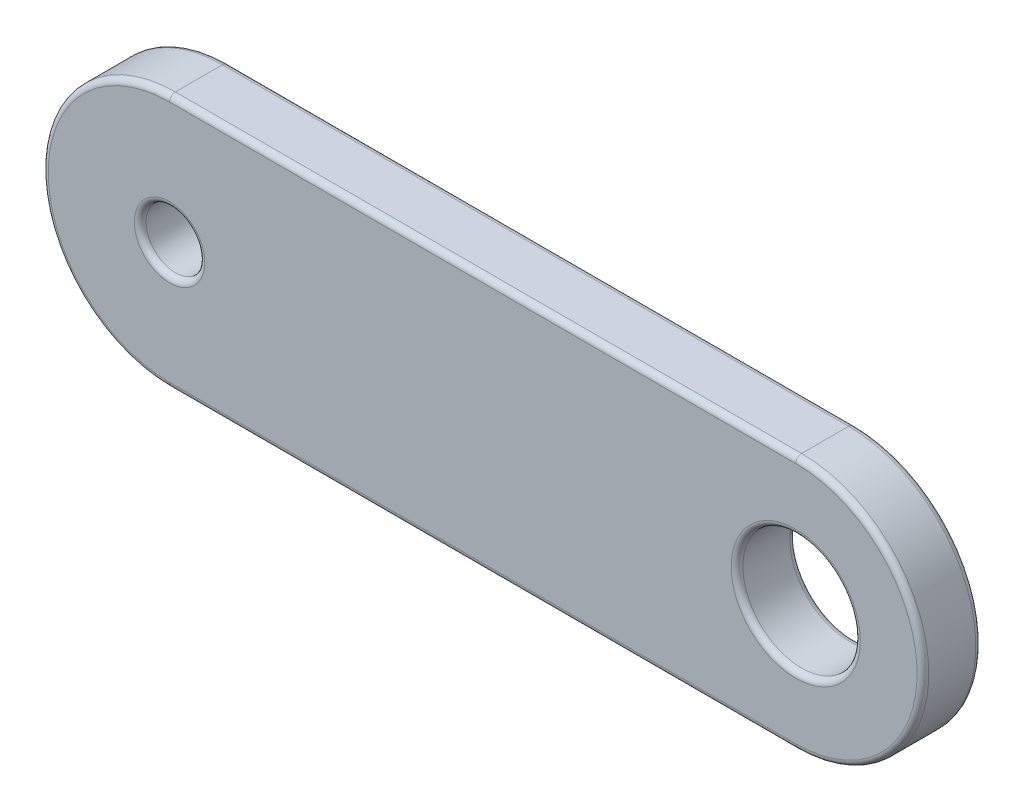
ISO-10303-21;
HEADER;
FILE_DESCRIPTION(('STEP AP214'),'2;1');
FILE_NAME('part.step','',(''),(''),'','','');
FILE_SCHEMA(('AUTOMOTIVE_DESIGN { 1 0 10303 214 1 1 1 1 }'));
ENDSEC;
DATA;
#1=APPLICATION_CONTEXT('core data for automotive mechanical design processes');
#2=APPLICATION_PROTOCOL_DEFINITION('international standard','automotive_design',2000,#1);
#3=PRODUCT_CONTEXT('',#1,'mechanical');
#4=PRODUCT('Part','Part','',(#3));
#5=PRODUCT_RELATED_PRODUCT_CATEGORY('part','',(#4));
#6=PRODUCT_DEFINITION_FORMATION('','',#4);
#7=PRODUCT_DEFINITION_CONTEXT('part definition',#1,'design');
#8=PRODUCT_DEFINITION('design','',#6,#7);
#9=PRODUCT_DEFINITION_SHAPE('','',#8);
#10=(LENGTH_UNIT() NAMED_UNIT(*) SI_UNIT(.MILLI.,.METRE.));
#11=(NAMED_UNIT(*) PLANE_ANGLE_UNIT() SI_UNIT($,.RADIAN.));
#12=(NAMED_UNIT(*) SI_UNIT($,.STERADIAN.) SOLID_ANGLE_UNIT());
#13=UNCERTAINTY_MEASURE_WITH_UNIT(LENGTH_MEASURE(1.E-05),#10,'distance_accuracy_value','');
#14=(GEOMETRIC_REPRESENTATION_CONTEXT(3) GLOBAL_UNCERTAINTY_ASSIGNED_CONTEXT((#13)) GLOBAL_UNIT_ASSIGNED_CONTEXT((#10,
#11,#12)) REPRESENTATION_CONTEXT('',''));
#15=CARTESIAN_POINT('',(0.,0.,0.));
#16=DIRECTION('',(0.,0.,1.));
#17=DIRECTION('',(1.,0.,0.));
#18=AXIS2_PLACEMENT_3D('',#15,#16,#17);
#19=CARTESIAN_POINT('',(-8.,0.,0.75));
#20=DIRECTION('',(0.,0.,1.));
#21=DIRECTION('',(1.,0.,0.));
#22=AXIS2_PLACEMENT_3D('',#19,#20,#21);
#23=PLANE('',#22);
#24=CARTESIAN_POINT('',(8.,0.,0.75));
#25=DIRECTION('',(0.,0.,1.));
#26=DIRECTION('',(1.,0.,0.));
#27=AXIS2_PLACEMENT_3D('',#24,#25,#26);
#28=CIRCLE('',#27,1.65);
#29=CARTESIAN_POINT('',(9.65,0.,0.75));
#30=VERTEX_POINT('',#29);
#31=EDGE_CURVE('E155',#30,#30,#28,.F.);
#32=ORIENTED_EDGE('',*,*,#31,.T.);
#33=EDGE_LOOP('',(#32));
#34=FACE_BOUND('',#33,.T.);
#35=CARTESIAN_POINT('',(-8.,0.,0.75));
#36=DIRECTION('',(0.,0.,1.));
#37=DIRECTION('',(1.,0.,0.));
#38=AXIS2_PLACEMENT_3D('',#35,#36,#37);
#39=CIRCLE('',#38,0.9);
#40=CARTESIAN_POINT('',(-7.1,0.,0.75));
#41=VERTEX_POINT('',#40);
#42=EDGE_CURVE('E152',#41,#41,#39,.F.);
#43=ORIENTED_EDGE('',*,*,#42,.T.);
#44=EDGE_LOOP('',(#43));
#45=FACE_BOUND('',#44,.T.);
#46=DIRECTION('',(-1.,0.,0.));
#47=VECTOR('',#46,1.);
#48=CARTESIAN_POINT('',(-8.,3.1,0.75));
#49=LINE('',#48,#47);
#50=CARTESIAN_POINT('',(8.,3.1,0.75));
#51=VERTEX_POINT('',#50);
#52=CARTESIAN_POINT('',(-8.,3.1,0.75));
#53=VERTEX_POINT('',#52);
#54=EDGE_CURVE('E143',#51,#53,#49,.T.);
#55=ORIENTED_EDGE('',*,*,#54,.T.);
#56=CARTESIAN_POINT('',(-8.,0.,0.75));
#57=DIRECTION('',(0.,0.,1.));
#58=DIRECTION('',(1.,0.,0.));
#59=AXIS2_PLACEMENT_3D('',#56,#57,#58);
#60=CIRCLE('',#59,3.1);
#61=CARTESIAN_POINT('',(-8.,-3.1,0.75));
#62=VERTEX_POINT('',#61);
#63=EDGE_CURVE('E149',#53,#62,#60,.T.);
#64=ORIENTED_EDGE('',*,*,#63,.T.);
#65=DIRECTION('',(1.,0.,0.));
#66=VECTOR('',#65,1.);
#67=CARTESIAN_POINT('',(8.,-3.1,0.75));
#68=LINE('',#67,#66);
#69=CARTESIAN_POINT('',(8.,-3.1,0.75));
#70=VERTEX_POINT('',#69);
#71=EDGE_CURVE('E147',#62,#70,#68,.T.);
#72=ORIENTED_EDGE('',*,*,#71,.T.);
#73=CARTESIAN_POINT('',(8.,0.,0.75));
#74=DIRECTION('',(0.,0.,1.));
#75=DIRECTION('',(1.,0.,0.));
#76=AXIS2_PLACEMENT_3D('',#73,#74,#75);
#77=CIRCLE('',#76,3.1);
#78=EDGE_CURVE('E145',#70,#51,#77,.T.);
#79=ORIENTED_EDGE('',*,*,#78,.T.);
#80=EDGE_LOOP('',(#55,#64,#72,#79));
#81=FACE_BOUND('',#80,.T.);
#82=ADVANCED_FACE('F33',(#34,#45,#81),#23,.T.);
#83=CARTESIAN_POINT('',(-8.,0.,-0.75));
#84=DIRECTION('',(0.,0.,1.));
#85=DIRECTION('',(1.,0.,0.));
#86=AXIS2_PLACEMENT_3D('',#83,#84,#85);
#87=PLANE('',#86);
#88=CARTESIAN_POINT('',(8.,0.,-0.75));
#89=DIRECTION('',(0.,0.,1.));
#90=DIRECTION('',(1.,0.,0.));
#91=AXIS2_PLACEMENT_3D('',#88,#89,#90);
#92=CIRCLE('',#91,1.65);
#93=CARTESIAN_POINT('',(9.65,0.,-0.75));
#94=VERTEX_POINT('',#93);
#95=EDGE_CURVE('E130',#94,#94,#92,.T.);
#96=ORIENTED_EDGE('',*,*,#95,.T.);
#97=EDGE_LOOP('',(#96));
#98=FACE_BOUND('',#97,.T.);
#99=CARTESIAN_POINT('',(-8.,0.,-0.75));
#100=DIRECTION('',(0.,0.,1.));
#101=DIRECTION('',(1.,0.,0.));
#102=AXIS2_PLACEMENT_3D('',#99,#100,#101);
#103=CIRCLE('',#102,0.9);
#104=CARTESIAN_POINT('',(-7.1,0.,-0.75));
#105=VERTEX_POINT('',#104);
#106=EDGE_CURVE('E127',#105,#105,#103,.T.);
#107=ORIENTED_EDGE('',*,*,#106,.T.);
#108=EDGE_LOOP('',(#107));
#109=FACE_BOUND('',#108,.T.);
#110=DIRECTION('',(1.,0.,0.));
#111=VECTOR('',#110,1.);
#112=CARTESIAN_POINT('',(-8.,-3.1,-0.75));
#113=LINE('',#112,#111);
#114=CARTESIAN_POINT('',(8.,-3.1,-0.75));
#115=VERTEX_POINT('',#114);
#116=CARTESIAN_POINT('',(-8.,-3.1,-0.75));
#117=VERTEX_POINT('',#116);
#118=EDGE_CURVE('E126',#115,#117,#113,.F.);
#119=ORIENTED_EDGE('',*,*,#118,.T.);
#120=CARTESIAN_POINT('',(-8.,0.,-0.75));
#121=DIRECTION('',(0.,0.,1.));
#122=DIRECTION('',(1.,0.,0.));
#123=AXIS2_PLACEMENT_3D('',#120,#121,#122);
#124=CIRCLE('',#123,3.1);
#125=CARTESIAN_POINT('',(-8.,3.1,-0.75));
#126=VERTEX_POINT('',#125);
#127=EDGE_CURVE('E105',#117,#126,#124,.F.);
#128=ORIENTED_EDGE('',*,*,#127,.T.);
#129=DIRECTION('',(-1.,0.,0.));
#130=VECTOR('',#129,1.);
#131=CARTESIAN_POINT('',(-8.,3.1,-0.75));
#132=LINE('',#131,#130);
#133=CARTESIAN_POINT('',(8.,3.1,-0.75));
#134=VERTEX_POINT('',#133);
#135=EDGE_CURVE('E115',#126,#134,#132,.F.);
#136=ORIENTED_EDGE('',*,*,#135,.T.);
#137=CARTESIAN_POINT('',(8.,0.,-0.75));
#138=DIRECTION('',(0.,0.,1.));
#139=DIRECTION('',(1.,0.,0.));
#140=AXIS2_PLACEMENT_3D('',#137,#138,#139);
#141=CIRCLE('',#140,3.1);
#142=EDGE_CURVE('E121',#134,#115,#141,.F.);
#143=ORIENTED_EDGE('',*,*,#142,.T.);
#144=EDGE_LOOP('',(#119,#128,#136,#143));
#145=FACE_BOUND('',#144,.T.);
#146=ADVANCED_FACE('F124',(#98,#109,#145),#87,.F.);
#147=CARTESIAN_POINT('',(-8.,0.,0.75));
#148=DIRECTION('',(0.,0.,-1.));
#149=DIRECTION('',(-1.,0.,0.));
#150=AXIS2_PLACEMENT_3D('',#147,#148,#149);
#151=CYLINDRICAL_SURFACE('',#150,3.25);
#152=DIRECTION('',(0.,0.,-1.));
#153=VECTOR('',#152,1.);
#154=CARTESIAN_POINT('',(-8.,3.25,0.75));
#155=LINE('',#154,#153);
#156=CARTESIAN_POINT('',(-8.,3.25,0.6));
#157=VERTEX_POINT('',#156);
#158=CARTESIAN_POINT('',(-8.,3.25,-0.6));
#159=VERTEX_POINT('',#158);
#160=EDGE_CURVE('E180',#157,#159,#155,.T.);
#161=ORIENTED_EDGE('',*,*,#160,.T.);
#162=CARTESIAN_POINT('',(-8.,0.,-0.6));
#163=DIRECTION('',(0.,0.,1.));
#164=DIRECTION('',(1.,0.,0.));
#165=AXIS2_PLACEMENT_3D('',#162,#163,#164);
#166=CIRCLE('',#165,3.25);
#167=CARTESIAN_POINT('',(-8.,-3.25,-0.6));
#168=VERTEX_POINT('',#167);
#169=EDGE_CURVE('E108',#159,#168,#166,.T.);
#170=ORIENTED_EDGE('',*,*,#169,.T.);
#171=DIRECTION('',(0.,0.,-1.));
#172=VECTOR('',#171,1.);
#173=CARTESIAN_POINT('',(-8.,-3.25,0.75));
#174=LINE('',#173,#172);
#175=CARTESIAN_POINT('',(-8.,-3.25,0.6));
#176=VERTEX_POINT('',#175);
#177=EDGE_CURVE('E122',#176,#168,#174,.T.);
#178=ORIENTED_EDGE('',*,*,#177,.F.);
#179=CARTESIAN_POINT('',(-8.,0.,0.6));
#180=DIRECTION('',(0.,0.,1.));
#181=DIRECTION('',(1.,0.,0.));
#182=AXIS2_PLACEMENT_3D('',#179,#180,#181);
#183=CIRCLE('',#182,3.25);
#184=EDGE_CURVE('E164',#176,#157,#183,.F.);
#185=ORIENTED_EDGE('',*,*,#184,.T.);
#186=EDGE_LOOP('',(#161,#170,#178,#185));
#187=FACE_BOUND('',#186,.T.);
#188=ADVANCED_FACE('F219',(#187),#151,.T.);
#189=CARTESIAN_POINT('',(-8.,-3.25,0.75));
#190=DIRECTION('',(0.,1.,0.));
#191=DIRECTION('',(-1.,0.,0.));
#192=AXIS2_PLACEMENT_3D('',#189,#190,#191);
#193=PLANE('',#192);
#194=ORIENTED_EDGE('',*,*,#177,.T.);
#195=DIRECTION('',(1.,0.,0.));
#196=VECTOR('',#195,1.);
#197=CARTESIAN_POINT('',(-8.,-3.25,-0.6));
#198=LINE('',#197,#196);
#199=CARTESIAN_POINT('',(8.,-3.25,-0.6));
#200=VERTEX_POINT('',#199);
#201=EDGE_CURVE('E170',#168,#200,#198,.T.);
#202=ORIENTED_EDGE('',*,*,#201,.T.);
#203=DIRECTION('',(0.,0.,-1.));
#204=VECTOR('',#203,1.);
#205=CARTESIAN_POINT('',(8.,-3.25,0.75));
#206=LINE('',#205,#204);
#207=CARTESIAN_POINT('',(8.,-3.25,0.6));
#208=VERTEX_POINT('',#207);
#209=EDGE_CURVE('E201',#208,#200,#206,.T.);
#210=ORIENTED_EDGE('',*,*,#209,.F.);
#211=DIRECTION('',(1.,0.,0.));
#212=VECTOR('',#211,1.);
#213=CARTESIAN_POINT('',(-8.,-3.25,0.6));
#214=LINE('',#213,#212);
#215=EDGE_CURVE('E168',#208,#176,#214,.F.);
#216=ORIENTED_EDGE('',*,*,#215,.T.);
#217=EDGE_LOOP('',(#194,#202,#210,#216));
#218=FACE_BOUND('',#217,.T.);
#219=ADVANCED_FACE('F205',(#218),#193,.F.);
#220=CARTESIAN_POINT('',(8.,0.,0.75));
#221=DIRECTION('',(0.,0.,-1.));
#222=DIRECTION('',(-1.,0.,0.));
#223=AXIS2_PLACEMENT_3D('',#220,#221,#222);
#224=CYLINDRICAL_SURFACE('',#223,3.25);
#225=ORIENTED_EDGE('',*,*,#209,.T.);
#226=CARTESIAN_POINT('',(8.,0.,-0.6));
#227=DIRECTION('',(0.,0.,1.));
#228=DIRECTION('',(1.,0.,0.));
#229=AXIS2_PLACEMENT_3D('',#226,#227,#228);
#230=CIRCLE('',#229,3.25);
#231=CARTESIAN_POINT('',(8.,3.25,-0.6));
#232=VERTEX_POINT('',#231);
#233=EDGE_CURVE('E50',#200,#232,#230,.T.);
#234=ORIENTED_EDGE('',*,*,#233,.T.);
#235=DIRECTION('',(0.,0.,-1.));
#236=VECTOR('',#235,1.);
#237=CARTESIAN_POINT('',(8.,3.25,0.75));
#238=LINE('',#237,#236);
#239=CARTESIAN_POINT('',(8.,3.25,0.6));
#240=VERTEX_POINT('',#239);
#241=EDGE_CURVE('E202',#240,#232,#238,.T.);
#242=ORIENTED_EDGE('',*,*,#241,.F.);
#243=CARTESIAN_POINT('',(8.,0.,0.6));
#244=DIRECTION('',(0.,0.,1.));
#245=DIRECTION('',(1.,0.,0.));
#246=AXIS2_PLACEMENT_3D('',#243,#244,#245);
#247=CIRCLE('',#246,3.25);
#248=EDGE_CURVE('E172',#240,#208,#247,.F.);
#249=ORIENTED_EDGE('',*,*,#248,.T.);
#250=EDGE_LOOP('',(#225,#234,#242,#249));
#251=FACE_BOUND('',#250,.T.);
#252=ADVANCED_FACE('F200',(#251),#224,.T.);
#253=CARTESIAN_POINT('',(-8.,3.25,0.75));
#254=DIRECTION('',(0.,-1.,0.));
#255=DIRECTION('',(1.,0.,0.));
#256=AXIS2_PLACEMENT_3D('',#253,#254,#255);
#257=PLANE('',#256);
#258=ORIENTED_EDGE('',*,*,#241,.T.);
#259=DIRECTION('',(-1.,0.,0.));
#260=VECTOR('',#259,1.);
#261=CARTESIAN_POINT('',(-8.,3.25,-0.6));
#262=LINE('',#261,#260);
#263=EDGE_CURVE('E11',#232,#159,#262,.T.);
#264=ORIENTED_EDGE('',*,*,#263,.T.);
#265=ORIENTED_EDGE('',*,*,#160,.F.);
#266=DIRECTION('',(-1.,0.,0.));
#267=VECTOR('',#266,1.);
#268=CARTESIAN_POINT('',(8.,3.25,0.6));
#269=LINE('',#268,#267);
#270=EDGE_CURVE('E42',#157,#240,#269,.F.);
#271=ORIENTED_EDGE('',*,*,#270,.T.);
#272=EDGE_LOOP('',(#258,#264,#265,#271));
#273=FACE_BOUND('',#272,.T.);
#274=ADVANCED_FACE('F221',(#273),#257,.F.);
#275=CARTESIAN_POINT('',(-8.,0.,0.75));
#276=DIRECTION('',(0.,0.,-1.));
#277=DIRECTION('',(-1.,0.,0.));
#278=AXIS2_PLACEMENT_3D('',#275,#276,#277);
#279=CYLINDRICAL_SURFACE('',#278,0.75);
#280=CARTESIAN_POINT('',(-8.,0.,-0.6));
#281=DIRECTION('',(0.,0.,1.));
#282=DIRECTION('',(1.,0.,0.));
#283=AXIS2_PLACEMENT_3D('',#280,#281,#282);
#284=CIRCLE('',#283,0.75);
#285=CARTESIAN_POINT('',(-7.25,0.,-0.6));
#286=VERTEX_POINT('',#285);
#287=EDGE_CURVE('E161',#286,#286,#284,.F.);
#288=ORIENTED_EDGE('',*,*,#287,.T.);
#289=EDGE_LOOP('',(#288));
#290=FACE_BOUND('',#289,.T.);
#291=CARTESIAN_POINT('',(-8.,0.,0.6));
#292=DIRECTION('',(0.,0.,1.));
#293=DIRECTION('',(1.,0.,0.));
#294=AXIS2_PLACEMENT_3D('',#291,#292,#293);
#295=CIRCLE('',#294,0.75);
#296=CARTESIAN_POINT('',(-7.25,0.,0.6));
#297=VERTEX_POINT('',#296);
#298=EDGE_CURVE('E158',#297,#297,#295,.T.);
#299=ORIENTED_EDGE('',*,*,#298,.T.);
#300=EDGE_LOOP('',(#299));
#301=FACE_BOUND('',#300,.T.);
#302=ADVANCED_FACE('F223',(#290,#301),#279,.F.);
#303=CARTESIAN_POINT('',(8.,0.,0.75));
#304=DIRECTION('',(0.,0.,-1.));
#305=DIRECTION('',(-1.,0.,0.));
#306=AXIS2_PLACEMENT_3D('',#303,#304,#305);
#307=CYLINDRICAL_SURFACE('',#306,1.5);
#308=CARTESIAN_POINT('',(8.,0.,-0.6));
#309=DIRECTION('',(0.,0.,1.));
#310=DIRECTION('',(1.,0.,0.));
#311=AXIS2_PLACEMENT_3D('',#308,#309,#310);
#312=CIRCLE('',#311,1.5);
#313=CARTESIAN_POINT('',(9.5,0.,-0.6));
#314=VERTEX_POINT('',#313);
#315=EDGE_CURVE('E140',#314,#314,#312,.F.);
#316=ORIENTED_EDGE('',*,*,#315,.T.);
#317=EDGE_LOOP('',(#316));
#318=FACE_BOUND('',#317,.T.);
#319=CARTESIAN_POINT('',(8.,0.,0.6));
#320=DIRECTION('',(0.,0.,1.));
#321=DIRECTION('',(1.,0.,0.));
#322=AXIS2_PLACEMENT_3D('',#319,#320,#321);
#323=CIRCLE('',#322,1.5);
#324=CARTESIAN_POINT('',(9.5,0.,0.6));
#325=VERTEX_POINT('',#324);
#326=EDGE_CURVE('E137',#325,#325,#323,.T.);
#327=ORIENTED_EDGE('',*,*,#326,.T.);
#328=EDGE_LOOP('',(#327));
#329=FACE_BOUND('',#328,.T.);
#330=ADVANCED_FACE('F229',(#318,#329),#307,.F.);
#331=CARTESIAN_POINT('',(8.,0.,-0.6));
#332=DIRECTION('',(0.,0.,1.));
#333=DIRECTION('',(1.,0.,0.));
#334=AXIS2_PLACEMENT_3D('',#331,#332,#333);
#335=TOROIDAL_SURFACE('',#334,1.65,0.15);
#336=ORIENTED_EDGE('',*,*,#315,.F.);
#337=EDGE_LOOP('',(#336));
#338=FACE_BOUND('',#337,.T.);
#339=ORIENTED_EDGE('',*,*,#95,.F.);
#340=EDGE_LOOP('',(#339));
#341=FACE_BOUND('',#340,.T.);
#342=ADVANCED_FACE('F244',(#338,#341),#335,.T.);
#343=CARTESIAN_POINT('',(8.,0.,0.6));
#344=DIRECTION('',(0.,0.,1.));
#345=DIRECTION('',(1.,0.,0.));
#346=AXIS2_PLACEMENT_3D('',#343,#344,#345);
#347=TOROIDAL_SURFACE('',#346,1.65,0.15);
#348=ORIENTED_EDGE('',*,*,#31,.F.);
#349=EDGE_LOOP('',(#348));
#350=FACE_BOUND('',#349,.T.);
#351=ORIENTED_EDGE('',*,*,#326,.F.);
#352=EDGE_LOOP('',(#351));
#353=FACE_BOUND('',#352,.T.);
#354=ADVANCED_FACE('F249',(#350,#353),#347,.T.);
#355=CARTESIAN_POINT('',(-8.,0.,-0.6));
#356=DIRECTION('',(0.,0.,1.));
#357=DIRECTION('',(1.,0.,0.));
#358=AXIS2_PLACEMENT_3D('',#355,#356,#357);
#359=TOROIDAL_SURFACE('',#358,0.9,0.15);
#360=ORIENTED_EDGE('',*,*,#287,.F.);
#361=EDGE_LOOP('',(#360));
#362=FACE_BOUND('',#361,.T.);
#363=ORIENTED_EDGE('',*,*,#106,.F.);
#364=EDGE_LOOP('',(#363));
#365=FACE_BOUND('',#364,.T.);
#366=ADVANCED_FACE('F257',(#362,#365),#359,.T.);
#367=CARTESIAN_POINT('',(-8.,0.,0.6));
#368=DIRECTION('',(0.,0.,1.));
#369=DIRECTION('',(1.,0.,0.));
#370=AXIS2_PLACEMENT_3D('',#367,#368,#369);
#371=TOROIDAL_SURFACE('',#370,0.9,0.15);
#372=ORIENTED_EDGE('',*,*,#42,.F.);
#373=EDGE_LOOP('',(#372));
#374=FACE_BOUND('',#373,.T.);
#375=ORIENTED_EDGE('',*,*,#298,.F.);
#376=EDGE_LOOP('',(#375));
#377=FACE_BOUND('',#376,.T.);
#378=ADVANCED_FACE('F263',(#374,#377),#371,.T.);
#379=CARTESIAN_POINT('',(8.,0.,-0.6));
#380=DIRECTION('',(0.,0.,1.));
#381=DIRECTION('',(1.,0.,0.));
#382=AXIS2_PLACEMENT_3D('',#379,#380,#381);
#383=TOROIDAL_SURFACE('',#382,3.1,0.15);
#384=CARTESIAN_POINT('',(8.,-3.1,-0.6));
#385=DIRECTION('',(-1.,0.,0.));
#386=DIRECTION('',(0.,0.,1.));
#387=AXIS2_PLACEMENT_3D('',#384,#385,#386);
#388=CIRCLE('',#387,0.15);
#389=EDGE_CURVE('E111',#115,#200,#388,.T.);
#390=ORIENTED_EDGE('',*,*,#389,.F.);
#391=ORIENTED_EDGE('',*,*,#142,.F.);
#392=CARTESIAN_POINT('',(8.,3.1,-0.6));
#393=DIRECTION('',(-1.,0.,0.));
#394=DIRECTION('',(0.,0.,1.));
#395=AXIS2_PLACEMENT_3D('',#392,#393,#394);
#396=CIRCLE('',#395,0.15);
#397=EDGE_CURVE('E118',#232,#134,#396,.T.);
#398=ORIENTED_EDGE('',*,*,#397,.F.);
#399=ORIENTED_EDGE('',*,*,#233,.F.);
#400=EDGE_LOOP('',(#390,#391,#398,#399));
#401=FACE_BOUND('',#400,.T.);
#402=ADVANCED_FACE('F214',(#401),#383,.T.);
#403=CARTESIAN_POINT('',(-8.,3.1,-0.6));
#404=DIRECTION('',(-1.,0.,0.));
#405=DIRECTION('',(0.,-1.,0.));
#406=AXIS2_PLACEMENT_3D('',#403,#404,#405);
#407=CYLINDRICAL_SURFACE('',#406,0.15);
#408=ORIENTED_EDGE('',*,*,#397,.T.);
#409=ORIENTED_EDGE('',*,*,#135,.F.);
#410=CARTESIAN_POINT('',(-8.,3.1,-0.6));
#411=DIRECTION('',(-1.,0.,0.));
#412=DIRECTION('',(0.,0.,1.));
#413=AXIS2_PLACEMENT_3D('',#410,#411,#412);
#414=CIRCLE('',#413,0.15);
#415=EDGE_CURVE('E101',#159,#126,#414,.T.);
#416=ORIENTED_EDGE('',*,*,#415,.F.);
#417=ORIENTED_EDGE('',*,*,#263,.F.);
#418=EDGE_LOOP('',(#408,#409,#416,#417));
#419=FACE_BOUND('',#418,.T.);
#420=ADVANCED_FACE('F116',(#419),#407,.T.);
#421=CARTESIAN_POINT('',(-8.,-3.1,-0.6));
#422=DIRECTION('',(1.,0.,0.));
#423=DIRECTION('',(0.,1.,0.));
#424=AXIS2_PLACEMENT_3D('',#421,#422,#423);
#425=CYLINDRICAL_SURFACE('',#424,0.15);
#426=ORIENTED_EDGE('',*,*,#389,.T.);
#427=ORIENTED_EDGE('',*,*,#201,.F.);
#428=CARTESIAN_POINT('',(-8.,-3.1,-0.6));
#429=DIRECTION('',(-1.,0.,0.));
#430=DIRECTION('',(0.,0.,1.));
#431=AXIS2_PLACEMENT_3D('',#428,#429,#430);
#432=CIRCLE('',#431,0.15);
#433=EDGE_CURVE('E112',#117,#168,#432,.T.);
#434=ORIENTED_EDGE('',*,*,#433,.F.);
#435=ORIENTED_EDGE('',*,*,#118,.F.);
#436=EDGE_LOOP('',(#426,#427,#434,#435));
#437=FACE_BOUND('',#436,.T.);
#438=ADVANCED_FACE('F216',(#437),#425,.T.);
#439=CARTESIAN_POINT('',(-8.,0.,-0.6));
#440=DIRECTION('',(0.,0.,1.));
#441=DIRECTION('',(1.,0.,0.));
#442=AXIS2_PLACEMENT_3D('',#439,#440,#441);
#443=TOROIDAL_SURFACE('',#442,3.1,0.15);
#444=ORIENTED_EDGE('',*,*,#415,.T.);
#445=ORIENTED_EDGE('',*,*,#127,.F.);
#446=ORIENTED_EDGE('',*,*,#433,.T.);
#447=ORIENTED_EDGE('',*,*,#169,.F.);
#448=EDGE_LOOP('',(#444,#445,#446,#447));
#449=FACE_BOUND('',#448,.T.);
#450=ADVANCED_FACE('F103',(#449),#443,.T.);
#451=CARTESIAN_POINT('',(8.,0.,0.6));
#452=DIRECTION('',(0.,0.,1.));
#453=DIRECTION('',(1.,0.,0.));
#454=AXIS2_PLACEMENT_3D('',#451,#452,#453);
#455=TOROIDAL_SURFACE('',#454,3.1,0.15);
#456=CARTESIAN_POINT('',(8.,-3.1,0.6));
#457=DIRECTION('',(-1.,0.,0.));
#458=DIRECTION('',(0.,0.,1.));
#459=AXIS2_PLACEMENT_3D('',#456,#457,#458);
#460=CIRCLE('',#459,0.15);
#461=EDGE_CURVE('E184',#208,#70,#460,.T.);
#462=ORIENTED_EDGE('',*,*,#461,.F.);
#463=ORIENTED_EDGE('',*,*,#248,.F.);
#464=CARTESIAN_POINT('',(8.,3.1,0.6));
#465=DIRECTION('',(-1.,0.,0.));
#466=DIRECTION('',(0.,0.,1.));
#467=AXIS2_PLACEMENT_3D('',#464,#465,#466);
#468=CIRCLE('',#467,0.15);
#469=EDGE_CURVE('E37',#51,#240,#468,.T.);
#470=ORIENTED_EDGE('',*,*,#469,.F.);
#471=ORIENTED_EDGE('',*,*,#78,.F.);
#472=EDGE_LOOP('',(#462,#463,#470,#471));
#473=FACE_BOUND('',#472,.T.);
#474=ADVANCED_FACE('F35',(#473),#455,.T.);
#475=CARTESIAN_POINT('',(-8.,3.1,0.6));
#476=DIRECTION('',(1.,0.,0.));
#477=DIRECTION('',(0.,1.,0.));
#478=AXIS2_PLACEMENT_3D('',#475,#476,#477);
#479=CYLINDRICAL_SURFACE('',#478,0.15);
#480=ORIENTED_EDGE('',*,*,#469,.T.);
#481=ORIENTED_EDGE('',*,*,#270,.F.);
#482=CARTESIAN_POINT('',(-8.,3.1,0.6));
#483=DIRECTION('',(-1.,0.,0.));
#484=DIRECTION('',(0.,0.,1.));
#485=AXIS2_PLACEMENT_3D('',#482,#483,#484);
#486=CIRCLE('',#485,0.15);
#487=EDGE_CURVE('E183',#53,#157,#486,.T.);
#488=ORIENTED_EDGE('',*,*,#487,.F.);
#489=ORIENTED_EDGE('',*,*,#54,.F.);
#490=EDGE_LOOP('',(#480,#481,#488,#489));
#491=FACE_BOUND('',#490,.T.);
#492=ADVANCED_FACE('F194',(#491),#479,.T.);
#493=CARTESIAN_POINT('',(-8.,-3.1,0.6));
#494=DIRECTION('',(-1.,0.,0.));
#495=DIRECTION('',(0.,-1.,0.));
#496=AXIS2_PLACEMENT_3D('',#493,#494,#495);
#497=CYLINDRICAL_SURFACE('',#496,0.15);
#498=ORIENTED_EDGE('',*,*,#461,.T.);
#499=ORIENTED_EDGE('',*,*,#71,.F.);
#500=CARTESIAN_POINT('',(-8.,-3.1,0.6));
#501=DIRECTION('',(-1.,0.,0.));
#502=DIRECTION('',(0.,0.,1.));
#503=AXIS2_PLACEMENT_3D('',#500,#501,#502);
#504=CIRCLE('',#503,0.15);
#505=EDGE_CURVE('E181',#176,#62,#504,.T.);
#506=ORIENTED_EDGE('',*,*,#505,.F.);
#507=ORIENTED_EDGE('',*,*,#215,.F.);
#508=EDGE_LOOP('',(#498,#499,#506,#507));
#509=FACE_BOUND('',#508,.T.);
#510=ADVANCED_FACE('F283',(#509),#497,.T.);
#511=CARTESIAN_POINT('',(-8.,0.,0.6));
#512=DIRECTION('',(0.,0.,1.));
#513=DIRECTION('',(1.,0.,0.));
#514=AXIS2_PLACEMENT_3D('',#511,#512,#513);
#515=TOROIDAL_SURFACE('',#514,3.1,0.15);
#516=ORIENTED_EDGE('',*,*,#487,.T.);
#517=ORIENTED_EDGE('',*,*,#184,.F.);
#518=ORIENTED_EDGE('',*,*,#505,.T.);
#519=ORIENTED_EDGE('',*,*,#63,.F.);
#520=EDGE_LOOP('',(#516,#517,#518,#519));
#521=FACE_BOUND('',#520,.T.);
#522=ADVANCED_FACE('F280',(#521),#515,.T.);
#523=CLOSED_SHELL('',(#82,#146,#188,#219,#252,#274,#302,#330,#342,#354,#366,#378,#402,#420,#438,
#450,#474,#492,#510,#522));
#524=MANIFOLD_SOLID_BREP('B2',#523);
#525=ADVANCED_BREP_SHAPE_REPRESENTATION('',(#18,#524),#14);
#526=SHAPE_DEFINITION_REPRESENTATION(#9,#525);
ENDSEC;
END-ISO-10303-21;
